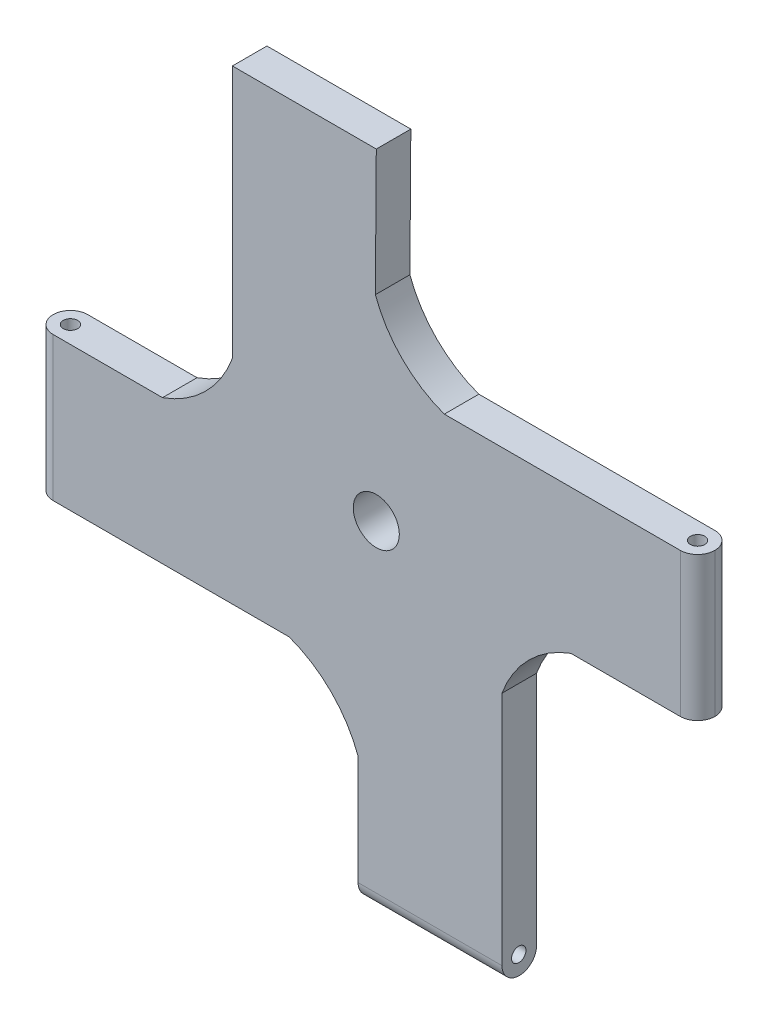
ISO-10303-21;
HEADER;
FILE_DESCRIPTION(('STEP AP214'),'2;1');
FILE_NAME('part.step','',(''),(''),'','','');
FILE_SCHEMA(('AUTOMOTIVE_DESIGN { 1 0 10303 214 1 1 1 1 }'));
ENDSEC;
DATA;
#1=APPLICATION_CONTEXT('core data for automotive mechanical design processes');
#2=APPLICATION_PROTOCOL_DEFINITION('international standard','automotive_design',2000,#1);
#3=PRODUCT_CONTEXT('',#1,'mechanical');
#4=PRODUCT('Part','Part','',(#3));
#5=PRODUCT_RELATED_PRODUCT_CATEGORY('part','',(#4));
#6=PRODUCT_DEFINITION_FORMATION('','',#4);
#7=PRODUCT_DEFINITION_CONTEXT('part definition',#1,'design');
#8=PRODUCT_DEFINITION('design','',#6,#7);
#9=PRODUCT_DEFINITION_SHAPE('','',#8);
#10=(LENGTH_UNIT() NAMED_UNIT(*) SI_UNIT(.MILLI.,.METRE.));
#11=(NAMED_UNIT(*) PLANE_ANGLE_UNIT() SI_UNIT($,.RADIAN.));
#12=(NAMED_UNIT(*) SI_UNIT($,.STERADIAN.) SOLID_ANGLE_UNIT());
#13=UNCERTAINTY_MEASURE_WITH_UNIT(LENGTH_MEASURE(1.E-05),#10,'distance_accuracy_value','');
#14=(GEOMETRIC_REPRESENTATION_CONTEXT(3) GLOBAL_UNCERTAINTY_ASSIGNED_CONTEXT((#13)) GLOBAL_UNIT_ASSIGNED_CONTEXT((#10,
#11,#12)) REPRESENTATION_CONTEXT('',''));
#15=CARTESIAN_POINT('',(0.,0.,0.));
#16=DIRECTION('',(0.,0.,1.));
#17=DIRECTION('',(1.,0.,0.));
#18=AXIS2_PLACEMENT_3D('',#15,#16,#17);
#19=CARTESIAN_POINT('',(-87.1613423245683,-13.7341731289876,6.));
#20=DIRECTION('',(0.,0.,-1.));
#21=DIRECTION('',(-1.,0.,0.));
#22=AXIS2_PLACEMENT_3D('',#19,#20,#21);
#23=CYLINDRICAL_SURFACE('',#22,20.);
#24=CARTESIAN_POINT('',(-87.1613423245683,-13.7341731289876,0.));
#25=DIRECTION('',(0.,0.,1.));
#26=DIRECTION('',(1.,0.,0.));
#27=AXIS2_PLACEMENT_3D('',#24,#25,#26);
#28=CIRCLE('',#27,20.);
#29=CARTESIAN_POINT('',(-80.5252849781846,-32.6011480559733,0.));
#30=VERTEX_POINT('',#29);
#31=CARTESIAN_POINT('',(-68.3848244538631,-20.6220157993082,0.));
#32=VERTEX_POINT('',#31);
#33=EDGE_CURVE('E181',#30,#32,#28,.T.);
#34=ORIENTED_EDGE('',*,*,#33,.F.);
#35=DIRECTION('',(0.,0.,-1.));
#36=VECTOR('',#35,1.);
#37=CARTESIAN_POINT('',(-80.5252849781846,-32.6011480559733,6.));
#38=LINE('',#37,#36);
#39=CARTESIAN_POINT('',(-80.5252849781846,-32.6011480559733,6.));
#40=VERTEX_POINT('',#39);
#41=EDGE_CURVE('E169',#40,#30,#38,.T.);
#42=ORIENTED_EDGE('',*,*,#41,.F.);
#43=CARTESIAN_POINT('',(-87.1613423245683,-13.7341731289876,6.));
#44=DIRECTION('',(0.,0.,1.));
#45=DIRECTION('',(1.,0.,0.));
#46=AXIS2_PLACEMENT_3D('',#43,#44,#45);
#47=CIRCLE('',#46,20.);
#48=CARTESIAN_POINT('',(-68.3848244538631,-20.6220157993082,6.));
#49=VERTEX_POINT('',#48);
#50=EDGE_CURVE('E176',#40,#49,#47,.T.);
#51=ORIENTED_EDGE('',*,*,#50,.T.);
#52=DIRECTION('',(0.,0.,-1.));
#53=VECTOR('',#52,1.);
#54=CARTESIAN_POINT('',(-68.3848244538631,-20.6220157993082,6.));
#55=LINE('',#54,#53);
#56=EDGE_CURVE('E228',#49,#32,#55,.T.);
#57=ORIENTED_EDGE('',*,*,#56,.T.);
#58=EDGE_LOOP('',(#34,#42,#51,#57));
#59=FACE_BOUND('',#58,.T.);
#60=ADVANCED_FACE('F35',(#59),#23,.F.);
#61=CARTESIAN_POINT('',(0.,-32.6011480559733,6.));
#62=DIRECTION('',(0.,1.,0.));
#63=DIRECTION('',(0.,0.,1.));
#64=AXIS2_PLACEMENT_3D('',#61,#62,#63);
#65=PLANE('',#64);
#66=CARTESIAN_POINT('',(-99.5252849781846,-32.6011480559733,3.));
#67=DIRECTION('',(0.,1.,0.));
#68=DIRECTION('',(0.,0.,1.));
#69=AXIS2_PLACEMENT_3D('',#66,#67,#68);
#70=CIRCLE('',#69,1.25);
#71=CARTESIAN_POINT('',(-99.5252849781846,-32.6011480559733,4.25));
#72=VERTEX_POINT('',#71);
#73=EDGE_CURVE('E652',#72,#72,#70,.T.);
#74=ORIENTED_EDGE('',*,*,#73,.F.);
#75=EDGE_LOOP('',(#74));
#76=FACE_BOUND('',#75,.T.);
#77=DIRECTION('',(1.,0.,0.));
#78=VECTOR('',#77,1.);
#79=CARTESIAN_POINT('',(0.,-32.6011480559733,0.));
#80=LINE('',#79,#78);
#81=CARTESIAN_POINT('',(-99.5252849781846,-32.6011480559733,0.));
#82=VERTEX_POINT('',#81);
#83=EDGE_CURVE('E230',#82,#30,#80,.T.);
#84=ORIENTED_EDGE('',*,*,#83,.F.);
#85=CARTESIAN_POINT('',(-99.5252849781846,-32.6011480559733,3.));
#86=DIRECTION('',(0.,1.,0.));
#87=DIRECTION('',(0.,0.,1.));
#88=AXIS2_PLACEMENT_3D('',#85,#86,#87);
#89=CIRCLE('',#88,3.);
#90=CARTESIAN_POINT('',(-102.525284978185,-32.6011480559733,3.));
#91=VERTEX_POINT('',#90);
#92=EDGE_CURVE('E58',#82,#91,#89,.T.);
#93=ORIENTED_EDGE('',*,*,#92,.T.);
#94=CARTESIAN_POINT('',(-99.5252849781846,-32.6011480559733,3.));
#95=DIRECTION('',(0.,1.,0.));
#96=DIRECTION('',(0.,0.,1.));
#97=AXIS2_PLACEMENT_3D('',#94,#95,#96);
#98=CIRCLE('',#97,3.);
#99=CARTESIAN_POINT('',(-99.5252849781846,-32.6011480559733,6.));
#100=VERTEX_POINT('',#99);
#101=EDGE_CURVE('E171',#91,#100,#98,.T.);
#102=ORIENTED_EDGE('',*,*,#101,.T.);
#103=DIRECTION('',(1.,0.,0.));
#104=VECTOR('',#103,1.);
#105=CARTESIAN_POINT('',(0.,-32.6011480559733,6.));
#106=LINE('',#105,#104);
#107=EDGE_CURVE('E166',#100,#40,#106,.T.);
#108=ORIENTED_EDGE('',*,*,#107,.T.);
#109=ORIENTED_EDGE('',*,*,#41,.T.);
#110=EDGE_LOOP('',(#84,#93,#102,#108,#109));
#111=FACE_BOUND('',#110,.T.);
#112=ADVANCED_FACE('F168',(#76,#111),#65,.T.);
#113=CARTESIAN_POINT('',(0.,-57.6011480559733,6.));
#114=DIRECTION('',(0.,1.,0.));
#115=DIRECTION('',(0.,0.,1.));
#116=AXIS2_PLACEMENT_3D('',#113,#114,#115);
#117=PLANE('',#116);
#118=CARTESIAN_POINT('',(-99.5252849781846,-57.6011480559733,3.));
#119=DIRECTION('',(0.,-1.,0.));
#120=DIRECTION('',(0.,0.,-1.));
#121=AXIS2_PLACEMENT_3D('',#118,#119,#120);
#122=CIRCLE('',#121,1.25);
#123=CARTESIAN_POINT('',(-99.5252849781846,-57.6011480559733,1.75));
#124=VERTEX_POINT('',#123);
#125=EDGE_CURVE('E198',#124,#124,#122,.T.);
#126=ORIENTED_EDGE('',*,*,#125,.F.);
#127=EDGE_LOOP('',(#126));
#128=FACE_BOUND('',#127,.T.);
#129=CARTESIAN_POINT('',(-99.5252849781846,-57.6011480559733,3.));
#130=DIRECTION('',(0.,1.,0.));
#131=DIRECTION('',(0.,0.,1.));
#132=AXIS2_PLACEMENT_3D('',#129,#130,#131);
#133=CIRCLE('',#132,3.);
#134=CARTESIAN_POINT('',(-99.5252849781846,-57.6011480559733,6.));
#135=VERTEX_POINT('',#134);
#136=CARTESIAN_POINT('',(-102.525284978185,-57.6011480559733,3.));
#137=VERTEX_POINT('',#136);
#138=EDGE_CURVE('E44',#135,#137,#133,.F.);
#139=ORIENTED_EDGE('',*,*,#138,.T.);
#140=CARTESIAN_POINT('',(-99.5252849781846,-57.6011480559733,3.));
#141=DIRECTION('',(0.,1.,0.));
#142=DIRECTION('',(0.,0.,1.));
#143=AXIS2_PLACEMENT_3D('',#140,#141,#142);
#144=CIRCLE('',#143,3.);
#145=CARTESIAN_POINT('',(-99.5252849781846,-57.6011480559733,0.));
#146=VERTEX_POINT('',#145);
#147=EDGE_CURVE('E11',#137,#146,#144,.F.);
#148=ORIENTED_EDGE('',*,*,#147,.T.);
#149=DIRECTION('',(1.,0.,0.));
#150=VECTOR('',#149,1.);
#151=CARTESIAN_POINT('',(0.,-57.6011480559733,0.));
#152=LINE('',#151,#150);
#153=CARTESIAN_POINT('',(-58.5252849781846,-57.6011480559733,0.));
#154=VERTEX_POINT('',#153);
#155=EDGE_CURVE('E233',#146,#154,#152,.T.);
#156=ORIENTED_EDGE('',*,*,#155,.T.);
#157=DIRECTION('',(0.,0.,-1.));
#158=VECTOR('',#157,1.);
#159=CARTESIAN_POINT('',(-58.5252849781846,-57.6011480559733,6.));
#160=LINE('',#159,#158);
#161=CARTESIAN_POINT('',(-58.5252849781846,-57.6011480559733,6.));
#162=VERTEX_POINT('',#161);
#163=EDGE_CURVE('E183',#162,#154,#160,.T.);
#164=ORIENTED_EDGE('',*,*,#163,.F.);
#165=DIRECTION('',(1.,0.,0.));
#166=VECTOR('',#165,1.);
#167=CARTESIAN_POINT('',(0.,-57.6011480559733,6.));
#168=LINE('',#167,#166);
#169=EDGE_CURVE('E175',#135,#162,#168,.T.);
#170=ORIENTED_EDGE('',*,*,#169,.F.);
#171=EDGE_LOOP('',(#139,#148,#156,#164,#170));
#172=FACE_BOUND('',#171,.T.);
#173=ADVANCED_FACE('F329',(#128,#172),#117,.F.);
#174=CARTESIAN_POINT('',(-65.3464197432838,-76.4020023056173,6.));
#175=DIRECTION('',(0.,0.,-1.));
#176=DIRECTION('',(-1.,0.,0.));
#177=AXIS2_PLACEMENT_3D('',#174,#175,#176);
#178=CYLINDRICAL_SURFACE('',#177,20.);
#179=CARTESIAN_POINT('',(-65.3464197432838,-76.4020023056173,0.));
#180=DIRECTION('',(0.,0.,1.));
#181=DIRECTION('',(1.,0.,0.));
#182=AXIS2_PLACEMENT_3D('',#179,#180,#181);
#183=CIRCLE('',#182,20.);
#184=CARTESIAN_POINT('',(-46.5455654936399,-69.580867540518,0.));
#185=VERTEX_POINT('',#184);
#186=EDGE_CURVE('E235',#154,#185,#183,.F.);
#187=ORIENTED_EDGE('',*,*,#186,.T.);
#188=DIRECTION('',(0.,0.,-1.));
#189=VECTOR('',#188,1.);
#190=CARTESIAN_POINT('',(-46.5455654936399,-69.580867540518,6.));
#191=LINE('',#190,#189);
#192=CARTESIAN_POINT('',(-46.5455654936399,-69.580867540518,6.));
#193=VERTEX_POINT('',#192);
#194=EDGE_CURVE('E276',#193,#185,#191,.T.);
#195=ORIENTED_EDGE('',*,*,#194,.F.);
#196=CARTESIAN_POINT('',(-65.3464197432838,-76.4020023056173,6.));
#197=DIRECTION('',(0.,0.,1.));
#198=DIRECTION('',(1.,0.,0.));
#199=AXIS2_PLACEMENT_3D('',#196,#197,#198);
#200=CIRCLE('',#199,20.);
#201=EDGE_CURVE('E202',#162,#193,#200,.F.);
#202=ORIENTED_EDGE('',*,*,#201,.F.);
#203=ORIENTED_EDGE('',*,*,#163,.T.);
#204=EDGE_LOOP('',(#187,#195,#202,#203));
#205=FACE_BOUND('',#204,.T.);
#206=ADVANCED_FACE('F335',(#205),#178,.F.);
#207=CARTESIAN_POINT('',(-46.5455654936399,0.,6.));
#208=DIRECTION('',(-1.,0.,0.));
#209=DIRECTION('',(0.,-1.,0.));
#210=AXIS2_PLACEMENT_3D('',#207,#208,#209);
#211=PLANE('',#210);
#212=CARTESIAN_POINT('',(-46.5455654936399,-88.3478026647778,3.08764742241793));
#213=DIRECTION('',(-1.,0.,0.));
#214=DIRECTION('',(0.,-1.,0.));
#215=AXIS2_PLACEMENT_3D('',#212,#213,#214);
#216=CIRCLE('',#215,1.25);
#217=CARTESIAN_POINT('',(-46.5455654936399,-89.5978026647778,3.08764742241793));
#218=VERTEX_POINT('',#217);
#219=EDGE_CURVE('E665',#218,#218,#216,.T.);
#220=ORIENTED_EDGE('',*,*,#219,.F.);
#221=EDGE_LOOP('',(#220));
#222=FACE_BOUND('',#221,.T.);
#223=DIRECTION('',(0.,1.,0.));
#224=VECTOR('',#223,1.);
#225=CARTESIAN_POINT('',(-46.5455654936399,0.,0.));
#226=LINE('',#225,#224);
#227=CARTESIAN_POINT('',(-46.5455654936399,-88.580867540518,0.));
#228=VERTEX_POINT('',#227);
#229=EDGE_CURVE('E238',#228,#185,#226,.T.);
#230=ORIENTED_EDGE('',*,*,#229,.F.);
#231=CARTESIAN_POINT('',(-46.5455654936399,-88.580867540518,3.));
#232=DIRECTION('',(-1.,0.,0.));
#233=DIRECTION('',(0.,-1.,0.));
#234=AXIS2_PLACEMENT_3D('',#231,#232,#233);
#235=CIRCLE('',#234,3.);
#236=CARTESIAN_POINT('',(-46.5455654936399,-91.580867540518,3.));
#237=VERTEX_POINT('',#236);
#238=EDGE_CURVE('E309',#228,#237,#235,.T.);
#239=ORIENTED_EDGE('',*,*,#238,.T.);
#240=CARTESIAN_POINT('',(-46.5455654936399,-88.580867540518,3.));
#241=DIRECTION('',(-1.,0.,0.));
#242=DIRECTION('',(0.,-1.,0.));
#243=AXIS2_PLACEMENT_3D('',#240,#241,#242);
#244=CIRCLE('',#243,3.);
#245=CARTESIAN_POINT('',(-46.5455654936399,-88.580867540518,6.));
#246=VERTEX_POINT('',#245);
#247=EDGE_CURVE('E307',#237,#246,#244,.T.);
#248=ORIENTED_EDGE('',*,*,#247,.T.);
#249=DIRECTION('',(0.,1.,0.));
#250=VECTOR('',#249,1.);
#251=CARTESIAN_POINT('',(-46.5455654936399,0.,6.));
#252=LINE('',#251,#250);
#253=EDGE_CURVE('E205',#246,#193,#252,.T.);
#254=ORIENTED_EDGE('',*,*,#253,.T.);
#255=ORIENTED_EDGE('',*,*,#194,.T.);
#256=EDGE_LOOP('',(#230,#239,#248,#254,#255));
#257=FACE_BOUND('',#256,.T.);
#258=ADVANCED_FACE('F390',(#222,#257),#211,.T.);
#259=CARTESIAN_POINT('',(-21.5455654936399,0.,6.));
#260=DIRECTION('',(-1.,0.,0.));
#261=DIRECTION('',(0.,-1.,0.));
#262=AXIS2_PLACEMENT_3D('',#259,#260,#261);
#263=PLANE('',#262);
#264=CARTESIAN_POINT('',(-21.5455654936399,-88.3478026647778,3.08764742241793));
#265=DIRECTION('',(1.,0.,0.));
#266=DIRECTION('',(0.,1.,0.));
#267=AXIS2_PLACEMENT_3D('',#264,#265,#266);
#268=CIRCLE('',#267,1.25);
#269=CARTESIAN_POINT('',(-21.5455654936399,-87.0978026647778,3.08764742241793));
#270=VERTEX_POINT('',#269);
#271=EDGE_CURVE('E659',#270,#270,#268,.T.);
#272=ORIENTED_EDGE('',*,*,#271,.F.);
#273=EDGE_LOOP('',(#272));
#274=FACE_BOUND('',#273,.T.);
#275=CARTESIAN_POINT('',(-21.5455654936399,-88.5808675405179,3.));
#276=DIRECTION('',(-1.,0.,0.));
#277=DIRECTION('',(0.,-1.,0.));
#278=AXIS2_PLACEMENT_3D('',#275,#276,#277);
#279=CIRCLE('',#278,3.);
#280=CARTESIAN_POINT('',(-21.5455654936399,-88.5808675405179,6.));
#281=VERTEX_POINT('',#280);
#282=CARTESIAN_POINT('',(-21.5455654936399,-91.5808675405179,3.));
#283=VERTEX_POINT('',#282);
#284=EDGE_CURVE('E303',#281,#283,#279,.F.);
#285=ORIENTED_EDGE('',*,*,#284,.T.);
#286=CARTESIAN_POINT('',(-21.5455654936399,-88.5808675405179,3.));
#287=DIRECTION('',(-1.,0.,0.));
#288=DIRECTION('',(0.,-1.,0.));
#289=AXIS2_PLACEMENT_3D('',#286,#287,#288);
#290=CIRCLE('',#289,3.);
#291=CARTESIAN_POINT('',(-21.5455654936399,-88.5808675405179,0.));
#292=VERTEX_POINT('',#291);
#293=EDGE_CURVE('E305',#283,#292,#290,.F.);
#294=ORIENTED_EDGE('',*,*,#293,.T.);
#295=DIRECTION('',(0.,1.,0.));
#296=VECTOR('',#295,1.);
#297=CARTESIAN_POINT('',(-21.5455654936399,0.,0.));
#298=LINE('',#297,#296);
#299=CARTESIAN_POINT('',(-21.5455654936399,-47.580867540518,0.));
#300=VERTEX_POINT('',#299);
#301=EDGE_CURVE('E240',#292,#300,#298,.T.);
#302=ORIENTED_EDGE('',*,*,#301,.T.);
#303=DIRECTION('',(0.,0.,-1.));
#304=VECTOR('',#303,1.);
#305=CARTESIAN_POINT('',(-21.5455654936399,-47.580867540518,6.));
#306=LINE('',#305,#304);
#307=CARTESIAN_POINT('',(-21.5455654936399,-47.580867540518,6.));
#308=VERTEX_POINT('',#307);
#309=EDGE_CURVE('E273',#308,#300,#306,.T.);
#310=ORIENTED_EDGE('',*,*,#309,.F.);
#311=DIRECTION('',(0.,1.,0.));
#312=VECTOR('',#311,1.);
#313=CARTESIAN_POINT('',(-21.5455654936399,0.,6.));
#314=LINE('',#313,#312);
#315=EDGE_CURVE('E207',#281,#308,#314,.T.);
#316=ORIENTED_EDGE('',*,*,#315,.F.);
#317=EDGE_LOOP('',(#285,#294,#302,#310,#316));
#318=FACE_BOUND('',#317,.T.);
#319=ADVANCED_FACE('F345',(#274,#318),#263,.F.);
#320=CARTESIAN_POINT('',(-2.74471124399596,-54.4020023056172,6.));
#321=DIRECTION('',(0.,0.,-1.));
#322=DIRECTION('',(-1.,0.,0.));
#323=AXIS2_PLACEMENT_3D('',#320,#321,#322);
#324=CYLINDRICAL_SURFACE('',#323,20.);
#325=CARTESIAN_POINT('',(-2.74471124399596,-54.4020023056172,0.));
#326=DIRECTION('',(0.,0.,1.));
#327=DIRECTION('',(1.,0.,0.));
#328=AXIS2_PLACEMENT_3D('',#325,#326,#327);
#329=CIRCLE('',#328,20.);
#330=CARTESIAN_POINT('',(-9.56584600909524,-35.6011480559733,0.));
#331=VERTEX_POINT('',#330);
#332=EDGE_CURVE('E242',#331,#300,#329,.T.);
#333=ORIENTED_EDGE('',*,*,#332,.F.);
#334=DIRECTION('',(0.,0.,-1.));
#335=VECTOR('',#334,1.);
#336=CARTESIAN_POINT('',(-9.56584600909524,-35.6011480559733,6.));
#337=LINE('',#336,#335);
#338=CARTESIAN_POINT('',(-9.56584600909524,-35.6011480559733,6.));
#339=VERTEX_POINT('',#338);
#340=EDGE_CURVE('E270',#339,#331,#337,.T.);
#341=ORIENTED_EDGE('',*,*,#340,.F.);
#342=CARTESIAN_POINT('',(-2.74471124399596,-54.4020023056172,6.));
#343=DIRECTION('',(0.,0.,1.));
#344=DIRECTION('',(1.,0.,0.));
#345=AXIS2_PLACEMENT_3D('',#342,#343,#344);
#346=CIRCLE('',#345,20.);
#347=EDGE_CURVE('E209',#339,#308,#346,.T.);
#348=ORIENTED_EDGE('',*,*,#347,.T.);
#349=ORIENTED_EDGE('',*,*,#309,.T.);
#350=EDGE_LOOP('',(#333,#341,#348,#349));
#351=FACE_BOUND('',#350,.T.);
#352=ADVANCED_FACE('F353',(#351),#324,.F.);
#353=CARTESIAN_POINT('',(0.,-35.6011480559733,6.));
#354=DIRECTION('',(0.,-1.,0.));
#355=DIRECTION('',(1.,0.,0.));
#356=AXIS2_PLACEMENT_3D('',#353,#354,#355);
#357=PLANE('',#356);
#358=CARTESIAN_POINT('',(9.43415399090477,-35.6011480559733,3.));
#359=DIRECTION('',(0.,-1.,0.));
#360=DIRECTION('',(1.,0.,0.));
#361=AXIS2_PLACEMENT_3D('',#358,#359,#360);
#362=CIRCLE('',#361,1.25);
#363=CARTESIAN_POINT('',(10.6841539909048,-35.6011480559733,3.));
#364=VERTEX_POINT('',#363);
#365=EDGE_CURVE('E316',#364,#364,#362,.T.);
#366=ORIENTED_EDGE('',*,*,#365,.F.);
#367=EDGE_LOOP('',(#366));
#368=FACE_BOUND('',#367,.T.);
#369=DIRECTION('',(-1.,0.,0.));
#370=VECTOR('',#369,1.);
#371=CARTESIAN_POINT('',(0.,-35.6011480559733,0.));
#372=LINE('',#371,#370);
#373=CARTESIAN_POINT('',(9.43415399090476,-35.6011480559733,0.));
#374=VERTEX_POINT('',#373);
#375=EDGE_CURVE('E245',#374,#331,#372,.T.);
#376=ORIENTED_EDGE('',*,*,#375,.F.);
#377=CARTESIAN_POINT('',(9.43415399090476,-35.6011480559733,3.));
#378=DIRECTION('',(0.,-1.,0.));
#379=DIRECTION('',(1.,0.,0.));
#380=AXIS2_PLACEMENT_3D('',#377,#378,#379);
#381=CIRCLE('',#380,3.);
#382=CARTESIAN_POINT('',(12.4341539909048,-35.6011480559732,3.));
#383=VERTEX_POINT('',#382);
#384=EDGE_CURVE('E295',#374,#383,#381,.T.);
#385=ORIENTED_EDGE('',*,*,#384,.T.);
#386=CARTESIAN_POINT('',(9.43415399090476,-35.6011480559733,3.));
#387=DIRECTION('',(0.,-1.,0.));
#388=DIRECTION('',(1.,0.,0.));
#389=AXIS2_PLACEMENT_3D('',#386,#387,#388);
#390=CIRCLE('',#389,3.);
#391=CARTESIAN_POINT('',(9.43415399090476,-35.6011480559733,6.));
#392=VERTEX_POINT('',#391);
#393=EDGE_CURVE('E293',#383,#392,#390,.T.);
#394=ORIENTED_EDGE('',*,*,#393,.T.);
#395=DIRECTION('',(-1.,0.,0.));
#396=VECTOR('',#395,1.);
#397=CARTESIAN_POINT('',(0.,-35.6011480559733,6.));
#398=LINE('',#397,#396);
#399=EDGE_CURVE('E212',#392,#339,#398,.T.);
#400=ORIENTED_EDGE('',*,*,#399,.T.);
#401=ORIENTED_EDGE('',*,*,#340,.T.);
#402=EDGE_LOOP('',(#376,#385,#394,#400,#401));
#403=FACE_BOUND('',#402,.T.);
#404=ADVANCED_FACE('F356',(#368,#403),#357,.T.);
#405=CARTESIAN_POINT('',(0.,-10.6011480559732,6.));
#406=DIRECTION('',(0.,-1.,0.));
#407=DIRECTION('',(1.,0.,0.));
#408=AXIS2_PLACEMENT_3D('',#405,#406,#407);
#409=PLANE('',#408);
#410=CARTESIAN_POINT('',(9.43415399090475,-10.6011480559732,3.));
#411=DIRECTION('',(0.,1.,0.));
#412=DIRECTION('',(-1.,0.,0.));
#413=AXIS2_PLACEMENT_3D('',#410,#411,#412);
#414=CIRCLE('',#413,1.25);
#415=CARTESIAN_POINT('',(8.18415399090476,-10.6011480559732,3.));
#416=VERTEX_POINT('',#415);
#417=EDGE_CURVE('E671',#416,#416,#414,.T.);
#418=ORIENTED_EDGE('',*,*,#417,.F.);
#419=EDGE_LOOP('',(#418));
#420=FACE_BOUND('',#419,.T.);
#421=CARTESIAN_POINT('',(9.43415399090476,-10.6011480559732,3.));
#422=DIRECTION('',(0.,-1.,0.));
#423=DIRECTION('',(1.,0.,0.));
#424=AXIS2_PLACEMENT_3D('',#421,#422,#423);
#425=CIRCLE('',#424,3.);
#426=CARTESIAN_POINT('',(9.43415399090476,-10.6011480559732,6.));
#427=VERTEX_POINT('',#426);
#428=CARTESIAN_POINT('',(12.4341539909048,-10.6011480559732,3.));
#429=VERTEX_POINT('',#428);
#430=EDGE_CURVE('E182',#427,#429,#425,.F.);
#431=ORIENTED_EDGE('',*,*,#430,.T.);
#432=CARTESIAN_POINT('',(9.43415399090476,-10.6011480559732,3.));
#433=DIRECTION('',(0.,-1.,0.));
#434=DIRECTION('',(1.,0.,0.));
#435=AXIS2_PLACEMENT_3D('',#432,#433,#434);
#436=CIRCLE('',#435,3.);
#437=CARTESIAN_POINT('',(9.43415399090476,-10.6011480559732,0.));
#438=VERTEX_POINT('',#437);
#439=EDGE_CURVE('E282',#429,#438,#436,.F.);
#440=ORIENTED_EDGE('',*,*,#439,.T.);
#441=DIRECTION('',(-1.,0.,0.));
#442=VECTOR('',#441,1.);
#443=CARTESIAN_POINT('',(0.,-10.6011480559732,0.));
#444=LINE('',#443,#442);
#445=CARTESIAN_POINT('',(-31.5658460090952,-10.6011480559732,0.));
#446=VERTEX_POINT('',#445);
#447=EDGE_CURVE('E247',#438,#446,#444,.T.);
#448=ORIENTED_EDGE('',*,*,#447,.T.);
#449=DIRECTION('',(0.,0.,-1.));
#450=VECTOR('',#449,1.);
#451=CARTESIAN_POINT('',(-31.5658460090952,-10.6011480559732,6.));
#452=LINE('',#451,#450);
#453=CARTESIAN_POINT('',(-31.5658460090952,-10.6011480559732,6.));
#454=VERTEX_POINT('',#453);
#455=EDGE_CURVE('E267',#454,#446,#452,.T.);
#456=ORIENTED_EDGE('',*,*,#455,.F.);
#457=DIRECTION('',(-1.,0.,0.));
#458=VECTOR('',#457,1.);
#459=CARTESIAN_POINT('',(0.,-10.6011480559732,6.));
#460=LINE('',#459,#458);
#461=EDGE_CURVE('E214',#427,#454,#460,.T.);
#462=ORIENTED_EDGE('',*,*,#461,.F.);
#463=EDGE_LOOP('',(#431,#440,#448,#456,#462));
#464=FACE_BOUND('',#463,.T.);
#465=ADVANCED_FACE('F368',(#420,#464),#409,.F.);
#466=CARTESIAN_POINT('',(-24.7447112439961,8.19970619367071,6.));
#467=DIRECTION('',(0.,0.,-1.));
#468=DIRECTION('',(-1.,0.,0.));
#469=AXIS2_PLACEMENT_3D('',#466,#467,#468);
#470=CYLINDRICAL_SURFACE('',#469,20.);
#471=CARTESIAN_POINT('',(-24.7447112439961,8.19970619367071,0.));
#472=DIRECTION('',(0.,0.,1.));
#473=DIRECTION('',(1.,0.,0.));
#474=AXIS2_PLACEMENT_3D('',#471,#472,#473);
#475=CIRCLE('',#474,20.);
#476=CARTESIAN_POINT('',(-43.54556549364,1.37857142857143,0.));
#477=VERTEX_POINT('',#476);
#478=EDGE_CURVE('E249',#446,#477,#475,.F.);
#479=ORIENTED_EDGE('',*,*,#478,.T.);
#480=DIRECTION('',(0.,0.,-1.));
#481=VECTOR('',#480,1.);
#482=CARTESIAN_POINT('',(-43.54556549364,1.37857142857143,6.));
#483=LINE('',#482,#481);
#484=CARTESIAN_POINT('',(-43.54556549364,1.37857142857143,6.));
#485=VERTEX_POINT('',#484);
#486=EDGE_CURVE('E265',#485,#477,#483,.T.);
#487=ORIENTED_EDGE('',*,*,#486,.F.);
#488=CARTESIAN_POINT('',(-24.7447112439961,8.19970619367071,6.));
#489=DIRECTION('',(0.,0.,1.));
#490=DIRECTION('',(1.,0.,0.));
#491=AXIS2_PLACEMENT_3D('',#488,#489,#490);
#492=CIRCLE('',#491,20.);
#493=EDGE_CURVE('E216',#454,#485,#492,.F.);
#494=ORIENTED_EDGE('',*,*,#493,.F.);
#495=ORIENTED_EDGE('',*,*,#455,.T.);
#496=EDGE_LOOP('',(#479,#487,#494,#495));
#497=FACE_BOUND('',#496,.T.);
#498=ADVANCED_FACE('F378',(#497),#470,.F.);
#499=CARTESIAN_POINT('',(-43.5533130132945,0.318226895054054,6.));
#500=DIRECTION('',(0.999973307823652,-0.00730641089894856,0.));
#501=DIRECTION('',(0.00730641089894856,0.999973307823652,0.));
#502=AXIS2_PLACEMENT_3D('',#499,#500,#501);
#503=PLANE('',#502);
#504=DIRECTION('',(-0.00730641089894856,-0.999973307823652,0.));
#505=VECTOR('',#504,1.);
#506=CARTESIAN_POINT('',(-43.5533130132945,0.318226895054054,0.));
#507=LINE('',#506,#505);
#508=CARTESIAN_POINT('',(-43.3848244538631,23.3779842006918,0.));
#509=VERTEX_POINT('',#508);
#510=EDGE_CURVE('E252',#509,#477,#507,.T.);
#511=ORIENTED_EDGE('',*,*,#510,.F.);
#512=DIRECTION('',(0.,0.,-1.));
#513=VECTOR('',#512,1.);
#514=CARTESIAN_POINT('',(-43.3848244538631,23.3779842006918,6.));
#515=LINE('',#514,#513);
#516=CARTESIAN_POINT('',(-43.3848244538631,23.3779842006918,6.));
#517=VERTEX_POINT('',#516);
#518=EDGE_CURVE('E263',#517,#509,#515,.T.);
#519=ORIENTED_EDGE('',*,*,#518,.F.);
#520=DIRECTION('',(-0.00730641089894856,-0.999973307823652,0.));
#521=VECTOR('',#520,1.);
#522=CARTESIAN_POINT('',(-43.5533130132945,0.318226895054054,6.));
#523=LINE('',#522,#521);
#524=EDGE_CURVE('E218',#517,#485,#523,.T.);
#525=ORIENTED_EDGE('',*,*,#524,.T.);
#526=ORIENTED_EDGE('',*,*,#486,.T.);
#527=EDGE_LOOP('',(#511,#519,#525,#526));
#528=FACE_BOUND('',#527,.T.);
#529=ADVANCED_FACE('F576',(#528),#503,.T.);
#530=CARTESIAN_POINT('',(0.,23.3779842006918,6.));
#531=DIRECTION('',(0.,1.,0.));
#532=DIRECTION('',(-1.,0.,0.));
#533=AXIS2_PLACEMENT_3D('',#530,#531,#532);
#534=PLANE('',#533);
#535=DIRECTION('',(1.,0.,0.));
#536=VECTOR('',#535,1.);
#537=CARTESIAN_POINT('',(0.,23.3779842006918,0.));
#538=LINE('',#537,#536);
#539=CARTESIAN_POINT('',(-68.3848244538631,23.3779842006918,0.));
#540=VERTEX_POINT('',#539);
#541=EDGE_CURVE('E255',#540,#509,#538,.T.);
#542=ORIENTED_EDGE('',*,*,#541,.F.);
#543=DIRECTION('',(0.,0.,-1.));
#544=VECTOR('',#543,1.);
#545=CARTESIAN_POINT('',(-68.3848244538631,23.3779842006918,6.));
#546=LINE('',#545,#544);
#547=CARTESIAN_POINT('',(-68.3848244538631,23.3779842006918,6.));
#548=VERTEX_POINT('',#547);
#549=EDGE_CURVE('E261',#548,#540,#546,.T.);
#550=ORIENTED_EDGE('',*,*,#549,.F.);
#551=DIRECTION('',(1.,0.,0.));
#552=VECTOR('',#551,1.);
#553=CARTESIAN_POINT('',(0.,23.3779842006918,6.));
#554=LINE('',#553,#552);
#555=EDGE_CURVE('E221',#548,#517,#554,.T.);
#556=ORIENTED_EDGE('',*,*,#555,.T.);
#557=ORIENTED_EDGE('',*,*,#518,.T.);
#558=EDGE_LOOP('',(#542,#550,#556,#557));
#559=FACE_BOUND('',#558,.T.);
#560=ADVANCED_FACE('F384',(#559),#534,.T.);
#561=CARTESIAN_POINT('',(-68.3848244538631,0.,6.));
#562=DIRECTION('',(1.,0.,0.));
#563=DIRECTION('',(0.,0.,-1.));
#564=AXIS2_PLACEMENT_3D('',#561,#562,#563);
#565=PLANE('',#564);
#566=DIRECTION('',(0.,-1.,0.));
#567=VECTOR('',#566,1.);
#568=CARTESIAN_POINT('',(-68.3848244538631,0.,0.));
#569=LINE('',#568,#567);
#570=EDGE_CURVE('E195',#540,#32,#569,.T.);
#571=ORIENTED_EDGE('',*,*,#570,.T.);
#572=ORIENTED_EDGE('',*,*,#56,.F.);
#573=DIRECTION('',(0.,-1.,0.));
#574=VECTOR('',#573,1.);
#575=CARTESIAN_POINT('',(-68.3848244538631,0.,6.));
#576=LINE('',#575,#574);
#577=EDGE_CURVE('E190',#548,#49,#576,.T.);
#578=ORIENTED_EDGE('',*,*,#577,.F.);
#579=ORIENTED_EDGE('',*,*,#549,.T.);
#580=EDGE_LOOP('',(#571,#572,#578,#579));
#581=FACE_BOUND('',#580,.T.);
#582=ADVANCED_FACE('F387',(#581),#565,.F.);
#583=CARTESIAN_POINT('',(-43.3848244538631,-32.6011480559733,6.));
#584=DIRECTION('',(0.,0.,-1.));
#585=DIRECTION('',(-1.,0.,0.));
#586=AXIS2_PLACEMENT_3D('',#583,#584,#585);
#587=CYLINDRICAL_SURFACE('',#586,4.00000000000001);
#588=CARTESIAN_POINT('',(-43.3848244538631,-32.6011480559733,6.));
#589=DIRECTION('',(0.,0.,1.));
#590=DIRECTION('',(1.,0.,0.));
#591=AXIS2_PLACEMENT_3D('',#588,#589,#590);
#592=CIRCLE('',#591,4.00000000000001);
#593=CARTESIAN_POINT('',(-39.3848244538631,-32.6011480559733,6.));
#594=VERTEX_POINT('',#593);
#595=EDGE_CURVE('E225',#594,#594,#592,.T.);
#596=ORIENTED_EDGE('',*,*,#595,.T.);
#597=EDGE_LOOP('',(#596));
#598=FACE_BOUND('',#597,.T.);
#599=CARTESIAN_POINT('',(-43.3848244538631,-32.6011480559733,0.));
#600=DIRECTION('',(0.,0.,1.));
#601=DIRECTION('',(1.,0.,0.));
#602=AXIS2_PLACEMENT_3D('',#599,#600,#601);
#603=CIRCLE('',#602,4.00000000000001);
#604=CARTESIAN_POINT('',(-39.3848244538631,-32.6011480559733,0.));
#605=VERTEX_POINT('',#604);
#606=EDGE_CURVE('E192',#605,#605,#603,.T.);
#607=ORIENTED_EDGE('',*,*,#606,.F.);
#608=EDGE_LOOP('',(#607));
#609=FACE_BOUND('',#608,.T.);
#610=ADVANCED_FACE('F555',(#598,#609),#587,.F.);
#611=CARTESIAN_POINT('',(0.,0.,6.));
#612=DIRECTION('',(0.,0.,1.));
#613=DIRECTION('',(1.,0.,0.));
#614=AXIS2_PLACEMENT_3D('',#611,#612,#613);
#615=PLANE('',#614);
#616=ORIENTED_EDGE('',*,*,#399,.F.);
#617=DIRECTION('',(0.,1.,0.));
#618=VECTOR('',#617,1.);
#619=CARTESIAN_POINT('',(9.43415399090476,-10.6011480559732,6.));
#620=LINE('',#619,#618);
#621=EDGE_CURVE('E301',#392,#427,#620,.T.);
#622=ORIENTED_EDGE('',*,*,#621,.T.);
#623=ORIENTED_EDGE('',*,*,#461,.T.);
#624=ORIENTED_EDGE('',*,*,#493,.T.);
#625=ORIENTED_EDGE('',*,*,#524,.F.);
#626=ORIENTED_EDGE('',*,*,#555,.F.);
#627=ORIENTED_EDGE('',*,*,#577,.T.);
#628=ORIENTED_EDGE('',*,*,#50,.F.);
#629=ORIENTED_EDGE('',*,*,#107,.F.);
#630=DIRECTION('',(0.,1.,0.));
#631=VECTOR('',#630,1.);
#632=CARTESIAN_POINT('',(-99.5252849781846,0.,6.));
#633=LINE('',#632,#631);
#634=EDGE_CURVE('E297',#100,#135,#633,.F.);
#635=ORIENTED_EDGE('',*,*,#634,.T.);
#636=ORIENTED_EDGE('',*,*,#169,.T.);
#637=ORIENTED_EDGE('',*,*,#201,.T.);
#638=ORIENTED_EDGE('',*,*,#253,.F.);
#639=DIRECTION('',(1.,0.,0.));
#640=VECTOR('',#639,1.);
#641=CARTESIAN_POINT('',(-21.5455654936399,-88.5808675405179,6.));
#642=LINE('',#641,#640);
#643=EDGE_CURVE('E299',#246,#281,#642,.T.);
#644=ORIENTED_EDGE('',*,*,#643,.T.);
#645=ORIENTED_EDGE('',*,*,#315,.T.);
#646=ORIENTED_EDGE('',*,*,#347,.F.);
#647=EDGE_LOOP('',(#616,#622,#623,#624,#625,#626,#627,#628,#629,#635,#636,#637,#638,#644,#645,#646));
#648=FACE_BOUND('',#647,.T.);
#649=ORIENTED_EDGE('',*,*,#595,.F.);
#650=EDGE_LOOP('',(#649));
#651=FACE_BOUND('',#650,.T.);
#652=ADVANCED_FACE('F186',(#648,#651),#615,.T.);
#653=CARTESIAN_POINT('',(0.,0.,0.));
#654=DIRECTION('',(0.,0.,1.));
#655=DIRECTION('',(1.,0.,0.));
#656=AXIS2_PLACEMENT_3D('',#653,#654,#655);
#657=PLANE('',#656);
#658=ORIENTED_EDGE('',*,*,#447,.F.);
#659=DIRECTION('',(0.,1.,0.));
#660=VECTOR('',#659,1.);
#661=CARTESIAN_POINT('',(9.43415399090476,0.,0.));
#662=LINE('',#661,#660);
#663=EDGE_CURVE('E290',#438,#374,#662,.F.);
#664=ORIENTED_EDGE('',*,*,#663,.T.);
#665=ORIENTED_EDGE('',*,*,#375,.T.);
#666=ORIENTED_EDGE('',*,*,#332,.T.);
#667=ORIENTED_EDGE('',*,*,#301,.F.);
#668=DIRECTION('',(1.,0.,0.));
#669=VECTOR('',#668,1.);
#670=CARTESIAN_POINT('',(0.,-88.5808675405179,0.));
#671=LINE('',#670,#669);
#672=EDGE_CURVE('E287',#292,#228,#671,.F.);
#673=ORIENTED_EDGE('',*,*,#672,.T.);
#674=ORIENTED_EDGE('',*,*,#229,.T.);
#675=ORIENTED_EDGE('',*,*,#186,.F.);
#676=ORIENTED_EDGE('',*,*,#155,.F.);
#677=DIRECTION('',(0.,1.,0.));
#678=VECTOR('',#677,1.);
#679=CARTESIAN_POINT('',(-99.5252849781846,-32.6011480559733,0.));
#680=LINE('',#679,#678);
#681=EDGE_CURVE('E284',#146,#82,#680,.T.);
#682=ORIENTED_EDGE('',*,*,#681,.T.);
#683=ORIENTED_EDGE('',*,*,#83,.T.);
#684=ORIENTED_EDGE('',*,*,#33,.T.);
#685=ORIENTED_EDGE('',*,*,#570,.F.);
#686=ORIENTED_EDGE('',*,*,#541,.T.);
#687=ORIENTED_EDGE('',*,*,#510,.T.);
#688=ORIENTED_EDGE('',*,*,#478,.F.);
#689=EDGE_LOOP('',(#658,#664,#665,#666,#667,#673,#674,#675,#676,#682,#683,#684,#685,#686,#687,#688));
#690=FACE_BOUND('',#689,.T.);
#691=ORIENTED_EDGE('',*,*,#606,.T.);
#692=EDGE_LOOP('',(#691));
#693=FACE_BOUND('',#692,.T.);
#694=ADVANCED_FACE('F373',(#690,#693),#657,.F.);
#695=CARTESIAN_POINT('',(-99.5252849781846,-52.6011480559733,3.));
#696=DIRECTION('',(0.,-1.,0.));
#697=DIRECTION('',(0.,0.,-1.));
#698=AXIS2_PLACEMENT_3D('',#695,#696,#697);
#699=CYLINDRICAL_SURFACE('',#698,1.25);
#700=CARTESIAN_POINT('',(-99.5252849781846,-52.6011480559733,3.));
#701=DIRECTION('',(0.,-1.,0.));
#702=DIRECTION('',(0.,0.,-1.));
#703=AXIS2_PLACEMENT_3D('',#700,#701,#702);
#704=CIRCLE('',#703,1.25);
#705=CARTESIAN_POINT('',(-99.5252849781846,-52.6011480559733,1.75));
#706=VERTEX_POINT('',#705);
#707=EDGE_CURVE('E231',#706,#706,#704,.T.);
#708=ORIENTED_EDGE('',*,*,#707,.F.);
#709=EDGE_LOOP('',(#708));
#710=FACE_BOUND('',#709,.T.);
#711=ORIENTED_EDGE('',*,*,#125,.T.);
#712=EDGE_LOOP('',(#711));
#713=FACE_BOUND('',#712,.T.);
#714=ADVANCED_FACE('F531',(#710,#713),#699,.F.);
#715=CARTESIAN_POINT('',(-99.5252849781846,-52.6011480559733,3.));
#716=DIRECTION('',(0.,-1.,0.));
#717=DIRECTION('',(0.,0.,-1.));
#718=AXIS2_PLACEMENT_3D('',#715,#716,#717);
#719=PLANE('',#718);
#720=ORIENTED_EDGE('',*,*,#707,.T.);
#721=EDGE_LOOP('',(#720));
#722=FACE_BOUND('',#721,.T.);
#723=ADVANCED_FACE('F523',(#722),#719,.T.);
#724=CARTESIAN_POINT('',(-99.5252849781846,-37.6011480559733,3.));
#725=DIRECTION('',(0.,1.,0.));
#726=DIRECTION('',(0.,0.,1.));
#727=AXIS2_PLACEMENT_3D('',#724,#725,#726);
#728=CYLINDRICAL_SURFACE('',#727,1.25);
#729=CARTESIAN_POINT('',(-99.5252849781846,-37.6011480559733,3.));
#730=DIRECTION('',(0.,1.,0.));
#731=DIRECTION('',(0.,0.,1.));
#732=AXIS2_PLACEMENT_3D('',#729,#730,#731);
#733=CIRCLE('',#732,1.25);
#734=CARTESIAN_POINT('',(-99.5252849781846,-37.6011480559733,4.25));
#735=VERTEX_POINT('',#734);
#736=EDGE_CURVE('E649',#735,#735,#733,.T.);
#737=ORIENTED_EDGE('',*,*,#736,.F.);
#738=EDGE_LOOP('',(#737));
#739=FACE_BOUND('',#738,.T.);
#740=ORIENTED_EDGE('',*,*,#73,.T.);
#741=EDGE_LOOP('',(#740));
#742=FACE_BOUND('',#741,.T.);
#743=ADVANCED_FACE('F515',(#739,#742),#728,.F.);
#744=CARTESIAN_POINT('',(-99.5252849781846,-37.6011480559733,3.));
#745=DIRECTION('',(0.,1.,0.));
#746=DIRECTION('',(0.,0.,1.));
#747=AXIS2_PLACEMENT_3D('',#744,#745,#746);
#748=PLANE('',#747);
#749=ORIENTED_EDGE('',*,*,#736,.T.);
#750=EDGE_LOOP('',(#749));
#751=FACE_BOUND('',#750,.T.);
#752=ADVANCED_FACE('F507',(#751),#748,.T.);
#753=CARTESIAN_POINT('',(-26.5455654936399,-88.3478026647778,3.08764742241793));
#754=DIRECTION('',(1.,0.,0.));
#755=DIRECTION('',(0.,1.,0.));
#756=AXIS2_PLACEMENT_3D('',#753,#754,#755);
#757=CYLINDRICAL_SURFACE('',#756,1.25);
#758=CARTESIAN_POINT('',(-26.5455654936399,-88.3478026647778,3.08764742241793));
#759=DIRECTION('',(1.,0.,0.));
#760=DIRECTION('',(0.,1.,0.));
#761=AXIS2_PLACEMENT_3D('',#758,#759,#760);
#762=CIRCLE('',#761,1.25);
#763=CARTESIAN_POINT('',(-26.5455654936399,-87.0978026647778,3.08764742241793));
#764=VERTEX_POINT('',#763);
#765=EDGE_CURVE('E656',#764,#764,#762,.T.);
#766=ORIENTED_EDGE('',*,*,#765,.F.);
#767=EDGE_LOOP('',(#766));
#768=FACE_BOUND('',#767,.T.);
#769=ORIENTED_EDGE('',*,*,#271,.T.);
#770=EDGE_LOOP('',(#769));
#771=FACE_BOUND('',#770,.T.);
#772=ADVANCED_FACE('F499',(#768,#771),#757,.F.);
#773=CARTESIAN_POINT('',(-26.5455654936399,-88.3478026647778,3.08764742241793));
#774=DIRECTION('',(1.,0.,0.));
#775=DIRECTION('',(0.,1.,0.));
#776=AXIS2_PLACEMENT_3D('',#773,#774,#775);
#777=PLANE('',#776);
#778=ORIENTED_EDGE('',*,*,#765,.T.);
#779=EDGE_LOOP('',(#778));
#780=FACE_BOUND('',#779,.T.);
#781=ADVANCED_FACE('F491',(#780),#777,.T.);
#782=CARTESIAN_POINT('',(-41.5455654936399,-88.3478026647778,3.08764742241793));
#783=DIRECTION('',(-1.,0.,0.));
#784=DIRECTION('',(0.,-1.,0.));
#785=AXIS2_PLACEMENT_3D('',#782,#783,#784);
#786=CYLINDRICAL_SURFACE('',#785,1.25);
#787=CARTESIAN_POINT('',(-41.5455654936399,-88.3478026647778,3.08764742241793));
#788=DIRECTION('',(-1.,0.,0.));
#789=DIRECTION('',(0.,-1.,0.));
#790=AXIS2_PLACEMENT_3D('',#787,#788,#789);
#791=CIRCLE('',#790,1.25);
#792=CARTESIAN_POINT('',(-41.5455654936399,-89.5978026647778,3.08764742241793));
#793=VERTEX_POINT('',#792);
#794=EDGE_CURVE('E662',#793,#793,#791,.T.);
#795=ORIENTED_EDGE('',*,*,#794,.F.);
#796=EDGE_LOOP('',(#795));
#797=FACE_BOUND('',#796,.T.);
#798=ORIENTED_EDGE('',*,*,#219,.T.);
#799=EDGE_LOOP('',(#798));
#800=FACE_BOUND('',#799,.T.);
#801=ADVANCED_FACE('F483',(#797,#800),#786,.F.);
#802=CARTESIAN_POINT('',(-41.5455654936399,-88.3478026647778,3.08764742241793));
#803=DIRECTION('',(-1.,0.,0.));
#804=DIRECTION('',(0.,-1.,0.));
#805=AXIS2_PLACEMENT_3D('',#802,#803,#804);
#806=PLANE('',#805);
#807=ORIENTED_EDGE('',*,*,#794,.T.);
#808=EDGE_LOOP('',(#807));
#809=FACE_BOUND('',#808,.T.);
#810=ADVANCED_FACE('F475',(#809),#806,.T.);
#811=CARTESIAN_POINT('',(9.43415399090475,-15.6011480559732,3.));
#812=DIRECTION('',(0.,1.,0.));
#813=DIRECTION('',(-1.,0.,0.));
#814=AXIS2_PLACEMENT_3D('',#811,#812,#813);
#815=CYLINDRICAL_SURFACE('',#814,1.25);
#816=CARTESIAN_POINT('',(9.43415399090475,-15.6011480559732,3.));
#817=DIRECTION('',(0.,1.,0.));
#818=DIRECTION('',(-1.,0.,0.));
#819=AXIS2_PLACEMENT_3D('',#816,#817,#818);
#820=CIRCLE('',#819,1.25);
#821=CARTESIAN_POINT('',(8.18415399090476,-15.6011480559732,3.));
#822=VERTEX_POINT('',#821);
#823=EDGE_CURVE('E668',#822,#822,#820,.T.);
#824=ORIENTED_EDGE('',*,*,#823,.F.);
#825=EDGE_LOOP('',(#824));
#826=FACE_BOUND('',#825,.T.);
#827=ORIENTED_EDGE('',*,*,#417,.T.);
#828=EDGE_LOOP('',(#827));
#829=FACE_BOUND('',#828,.T.);
#830=ADVANCED_FACE('F467',(#826,#829),#815,.F.);
#831=CARTESIAN_POINT('',(9.43415399090475,-15.6011480559732,3.));
#832=DIRECTION('',(0.,1.,0.));
#833=DIRECTION('',(-1.,0.,0.));
#834=AXIS2_PLACEMENT_3D('',#831,#832,#833);
#835=PLANE('',#834);
#836=ORIENTED_EDGE('',*,*,#823,.T.);
#837=EDGE_LOOP('',(#836));
#838=FACE_BOUND('',#837,.T.);
#839=ADVANCED_FACE('F459',(#838),#835,.T.);
#840=CARTESIAN_POINT('',(9.43415399090477,-30.6011480559733,3.));
#841=DIRECTION('',(0.,-1.,0.));
#842=DIRECTION('',(1.,0.,0.));
#843=AXIS2_PLACEMENT_3D('',#840,#841,#842);
#844=CYLINDRICAL_SURFACE('',#843,1.25);
#845=CARTESIAN_POINT('',(9.43415399090477,-30.6011480559733,3.));
#846=DIRECTION('',(0.,-1.,0.));
#847=DIRECTION('',(1.,0.,0.));
#848=AXIS2_PLACEMENT_3D('',#845,#846,#847);
#849=CIRCLE('',#848,1.25);
#850=CARTESIAN_POINT('',(10.6841539909048,-30.6011480559733,3.));
#851=VERTEX_POINT('',#850);
#852=EDGE_CURVE('E674',#851,#851,#849,.T.);
#853=ORIENTED_EDGE('',*,*,#852,.F.);
#854=EDGE_LOOP('',(#853));
#855=FACE_BOUND('',#854,.T.);
#856=ORIENTED_EDGE('',*,*,#365,.T.);
#857=EDGE_LOOP('',(#856));
#858=FACE_BOUND('',#857,.T.);
#859=ADVANCED_FACE('F451',(#855,#858),#844,.F.);
#860=CARTESIAN_POINT('',(9.43415399090477,-30.6011480559733,3.));
#861=DIRECTION('',(0.,-1.,0.));
#862=DIRECTION('',(1.,0.,0.));
#863=AXIS2_PLACEMENT_3D('',#860,#861,#862);
#864=PLANE('',#863);
#865=ORIENTED_EDGE('',*,*,#852,.T.);
#866=EDGE_LOOP('',(#865));
#867=FACE_BOUND('',#866,.T.);
#868=ADVANCED_FACE('F417',(#867),#864,.T.);
#869=CARTESIAN_POINT('',(9.43415399090476,0.,3.));
#870=DIRECTION('',(0.,-1.,0.));
#871=DIRECTION('',(0.,0.,-1.));
#872=AXIS2_PLACEMENT_3D('',#869,#870,#871);
#873=CYLINDRICAL_SURFACE('',#872,3.);
#874=ORIENTED_EDGE('',*,*,#621,.F.);
#875=ORIENTED_EDGE('',*,*,#393,.F.);
#876=DIRECTION('',(0.,1.,0.));
#877=VECTOR('',#876,1.);
#878=CARTESIAN_POINT('',(12.4341539909048,-35.6011480559732,3.));
#879=LINE('',#878,#877);
#880=EDGE_CURVE('E314',#429,#383,#879,.F.);
#881=ORIENTED_EDGE('',*,*,#880,.F.);
#882=ORIENTED_EDGE('',*,*,#430,.F.);
#883=EDGE_LOOP('',(#874,#875,#881,#882));
#884=FACE_BOUND('',#883,.T.);
#885=ADVANCED_FACE('F360',(#884),#873,.T.);
#886=CARTESIAN_POINT('',(9.43415399090476,0.,3.));
#887=DIRECTION('',(0.,1.,0.));
#888=DIRECTION('',(0.,0.,1.));
#889=AXIS2_PLACEMENT_3D('',#886,#887,#888);
#890=CYLINDRICAL_SURFACE('',#889,3.);
#891=ORIENTED_EDGE('',*,*,#384,.F.);
#892=ORIENTED_EDGE('',*,*,#663,.F.);
#893=ORIENTED_EDGE('',*,*,#439,.F.);
#894=ORIENTED_EDGE('',*,*,#880,.T.);
#895=EDGE_LOOP('',(#891,#892,#893,#894));
#896=FACE_BOUND('',#895,.T.);
#897=ADVANCED_FACE('F364',(#896),#890,.T.);
#898=CARTESIAN_POINT('',(0.,-88.5808675405179,3.));
#899=DIRECTION('',(-1.,0.,0.));
#900=DIRECTION('',(0.,-1.,0.));
#901=AXIS2_PLACEMENT_3D('',#898,#899,#900);
#902=CYLINDRICAL_SURFACE('',#901,3.);
#903=ORIENTED_EDGE('',*,*,#643,.F.);
#904=ORIENTED_EDGE('',*,*,#247,.F.);
#905=DIRECTION('',(1.,0.,0.));
#906=VECTOR('',#905,1.);
#907=CARTESIAN_POINT('',(-46.5455654936399,-91.580867540518,3.));
#908=LINE('',#907,#906);
#909=EDGE_CURVE('E317',#283,#237,#908,.F.);
#910=ORIENTED_EDGE('',*,*,#909,.F.);
#911=ORIENTED_EDGE('',*,*,#284,.F.);
#912=EDGE_LOOP('',(#903,#904,#910,#911));
#913=FACE_BOUND('',#912,.T.);
#914=ADVANCED_FACE('F343',(#913),#902,.T.);
#915=CARTESIAN_POINT('',(0.,-88.5808675405179,3.));
#916=DIRECTION('',(1.,0.,0.));
#917=DIRECTION('',(0.,1.,0.));
#918=AXIS2_PLACEMENT_3D('',#915,#916,#917);
#919=CYLINDRICAL_SURFACE('',#918,3.);
#920=ORIENTED_EDGE('',*,*,#238,.F.);
#921=ORIENTED_EDGE('',*,*,#672,.F.);
#922=ORIENTED_EDGE('',*,*,#293,.F.);
#923=ORIENTED_EDGE('',*,*,#909,.T.);
#924=EDGE_LOOP('',(#920,#921,#922,#923));
#925=FACE_BOUND('',#924,.T.);
#926=ADVANCED_FACE('F418',(#925),#919,.T.);
#927=CARTESIAN_POINT('',(-99.5252849781846,0.,3.));
#928=DIRECTION('',(0.,1.,0.));
#929=DIRECTION('',(0.,0.,1.));
#930=AXIS2_PLACEMENT_3D('',#927,#928,#929);
#931=CYLINDRICAL_SURFACE('',#930,3.);
#932=DIRECTION('',(0.,1.,0.));
#933=VECTOR('',#932,1.);
#934=CARTESIAN_POINT('',(-102.525284978185,0.,3.));
#935=LINE('',#934,#933);
#936=EDGE_CURVE('E39',#137,#91,#935,.T.);
#937=ORIENTED_EDGE('',*,*,#936,.F.);
#938=ORIENTED_EDGE('',*,*,#138,.F.);
#939=ORIENTED_EDGE('',*,*,#634,.F.);
#940=ORIENTED_EDGE('',*,*,#101,.F.);
#941=EDGE_LOOP('',(#937,#938,#939,#940));
#942=FACE_BOUND('',#941,.T.);
#943=ADVANCED_FACE('F37',(#942),#931,.T.);
#944=CARTESIAN_POINT('',(-99.5252849781846,0.,3.));
#945=DIRECTION('',(0.,-1.,0.));
#946=DIRECTION('',(0.,0.,-1.));
#947=AXIS2_PLACEMENT_3D('',#944,#945,#946);
#948=CYLINDRICAL_SURFACE('',#947,3.);
#949=ORIENTED_EDGE('',*,*,#147,.F.);
#950=ORIENTED_EDGE('',*,*,#936,.T.);
#951=ORIENTED_EDGE('',*,*,#92,.F.);
#952=ORIENTED_EDGE('',*,*,#681,.F.);
#953=EDGE_LOOP('',(#949,#950,#951,#952));
#954=FACE_BOUND('',#953,.T.);
#955=ADVANCED_FACE('F325',(#954),#948,.T.);
#956=CLOSED_SHELL('',(#60,#112,#173,#206,#258,#319,#352,#404,#465,#498,#529,#560,#582,#610,#652,
#694,#714,#723,#743,#752,#772,#781,#801,#810,#830,#839,#859,#868,#885,#897,#914,#926,#943,#955));
#957=MANIFOLD_SOLID_BREP('B2',#956);
#958=ADVANCED_BREP_SHAPE_REPRESENTATION('',(#18,#957),#14);
#959=SHAPE_DEFINITION_REPRESENTATION(#9,#958);
ENDSEC;
END-ISO-10303-21;
